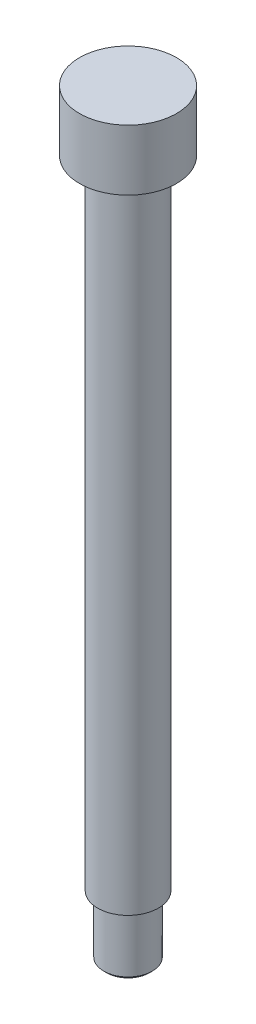
ISO-10303-21;
HEADER;
FILE_DESCRIPTION(('STEP AP214'),'2;1');
FILE_NAME('part.step','',(''),(''),'','','');
FILE_SCHEMA(('AUTOMOTIVE_DESIGN { 1 0 10303 214 1 1 1 1 }'));
ENDSEC;
DATA;
#1=APPLICATION_CONTEXT('core data for automotive mechanical design processes');
#2=APPLICATION_PROTOCOL_DEFINITION('international standard','automotive_design',2000,#1);
#3=PRODUCT_CONTEXT('',#1,'mechanical');
#4=PRODUCT('Part','Part','',(#3));
#5=PRODUCT_RELATED_PRODUCT_CATEGORY('part','',(#4));
#6=PRODUCT_DEFINITION_FORMATION('','',#4);
#7=PRODUCT_DEFINITION_CONTEXT('part definition',#1,'design');
#8=PRODUCT_DEFINITION('design','',#6,#7);
#9=PRODUCT_DEFINITION_SHAPE('','',#8);
#10=(LENGTH_UNIT() NAMED_UNIT(*) SI_UNIT(.MILLI.,.METRE.));
#11=(NAMED_UNIT(*) PLANE_ANGLE_UNIT() SI_UNIT($,.RADIAN.));
#12=(NAMED_UNIT(*) SI_UNIT($,.STERADIAN.) SOLID_ANGLE_UNIT());
#13=UNCERTAINTY_MEASURE_WITH_UNIT(LENGTH_MEASURE(1.E-05),#10,'distance_accuracy_value','');
#14=(GEOMETRIC_REPRESENTATION_CONTEXT(3) GLOBAL_UNCERTAINTY_ASSIGNED_CONTEXT((#13)) GLOBAL_UNIT_ASSIGNED_CONTEXT((#10,
#11,#12)) REPRESENTATION_CONTEXT('',''));
#15=CARTESIAN_POINT('',(0.,0.,0.));
#16=DIRECTION('',(0.,0.,1.));
#17=DIRECTION('',(1.,0.,0.));
#18=AXIS2_PLACEMENT_3D('',#15,#16,#17);
#19=CARTESIAN_POINT('',(0.,0.,0.));
#20=DIRECTION('',(0.,1.,0.));
#21=DIRECTION('',(0.,0.,1.));
#22=AXIS2_PLACEMENT_3D('',#19,#20,#21);
#23=PLANE('',#22);
#24=CARTESIAN_POINT('',(0.,0.,0.));
#25=DIRECTION('',(0.,-1.,0.));
#26=DIRECTION('',(0.,0.,-1.));
#27=AXIS2_PLACEMENT_3D('',#24,#25,#26);
#28=CIRCLE('',#27,8.);
#29=CARTESIAN_POINT('',(0.,0.,-8.));
#30=VERTEX_POINT('',#29);
#31=EDGE_CURVE('E59',#30,#30,#28,.T.);
#32=ORIENTED_EDGE('',*,*,#31,.F.);
#33=EDGE_LOOP('',(#32));
#34=FACE_BOUND('',#33,.T.);
#35=ADVANCED_FACE('F47',(#34),#23,.T.);
#36=CARTESIAN_POINT('',(0.,-130.,0.));
#37=DIRECTION('',(0.,-1.,0.));
#38=DIRECTION('',(0.,0.,-1.));
#39=AXIS2_PLACEMENT_3D('',#36,#37,#38);
#40=CYLINDRICAL_SURFACE('',#39,8.);
#41=ORIENTED_EDGE('',*,*,#31,.T.);
#42=EDGE_LOOP('',(#41));
#43=FACE_BOUND('',#42,.T.);
#44=CARTESIAN_POINT('',(0.,-9.99999999999999,0.));
#45=DIRECTION('',(0.,-1.,0.));
#46=DIRECTION('',(0.,0.,-1.));
#47=AXIS2_PLACEMENT_3D('',#44,#45,#46);
#48=CIRCLE('',#47,8.);
#49=CARTESIAN_POINT('',(0.,-9.99999999999999,-8.));
#50=VERTEX_POINT('',#49);
#51=EDGE_CURVE('E63',#50,#50,#48,.T.);
#52=ORIENTED_EDGE('',*,*,#51,.F.);
#53=EDGE_LOOP('',(#52));
#54=FACE_BOUND('',#53,.T.);
#55=ADVANCED_FACE('F96',(#43,#54),#40,.T.);
#56=CARTESIAN_POINT('',(5.,-10.,0.));
#57=DIRECTION('',(0.,-1.,0.));
#58=DIRECTION('',(0.,0.,-1.));
#59=AXIS2_PLACEMENT_3D('',#56,#57,#58);
#60=PLANE('',#59);
#61=ORIENTED_EDGE('',*,*,#51,.T.);
#62=EDGE_LOOP('',(#61));
#63=FACE_BOUND('',#62,.T.);
#64=CARTESIAN_POINT('',(0.,-9.99999999999999,0.));
#65=DIRECTION('',(0.,-1.,0.));
#66=DIRECTION('',(0.,0.,-1.));
#67=AXIS2_PLACEMENT_3D('',#64,#65,#66);
#68=CIRCLE('',#67,5.);
#69=CARTESIAN_POINT('',(0.,-9.99999999999999,-5.));
#70=VERTEX_POINT('',#69);
#71=EDGE_CURVE('E68',#70,#70,#68,.T.);
#72=ORIENTED_EDGE('',*,*,#71,.F.);
#73=EDGE_LOOP('',(#72));
#74=FACE_BOUND('',#73,.T.);
#75=ADVANCED_FACE('F92',(#63,#74),#60,.T.);
#76=CARTESIAN_POINT('',(0.,-130.,0.));
#77=DIRECTION('',(0.,-1.,0.));
#78=DIRECTION('',(0.,0.,-1.));
#79=AXIS2_PLACEMENT_3D('',#76,#77,#78);
#80=CYLINDRICAL_SURFACE('',#79,5.00000000000001);
#81=ORIENTED_EDGE('',*,*,#71,.T.);
#82=EDGE_LOOP('',(#81));
#83=FACE_BOUND('',#82,.T.);
#84=CARTESIAN_POINT('',(0.,-115.,0.));
#85=DIRECTION('',(0.,-1.,0.));
#86=DIRECTION('',(0.,0.,-1.));
#87=AXIS2_PLACEMENT_3D('',#84,#85,#86);
#88=CIRCLE('',#87,5.00000000000001);
#89=CARTESIAN_POINT('',(0.,-115.,-5.00000000000001));
#90=VERTEX_POINT('',#89);
#91=EDGE_CURVE('E71',#90,#90,#88,.T.);
#92=ORIENTED_EDGE('',*,*,#91,.F.);
#93=EDGE_LOOP('',(#92));
#94=FACE_BOUND('',#93,.T.);
#95=ADVANCED_FACE('F82',(#83,#94),#80,.T.);
#96=CARTESIAN_POINT('',(5.00000000000001,-115.,0.));
#97=DIRECTION('',(0.,-1.,0.));
#98=DIRECTION('',(0.,0.,-1.));
#99=AXIS2_PLACEMENT_3D('',#96,#97,#98);
#100=PLANE('',#99);
#101=ORIENTED_EDGE('',*,*,#91,.T.);
#102=EDGE_LOOP('',(#101));
#103=FACE_BOUND('',#102,.T.);
#104=CARTESIAN_POINT('',(0.,-115.,0.));
#105=DIRECTION('',(0.,-1.,0.));
#106=DIRECTION('',(0.,0.,-1.));
#107=AXIS2_PLACEMENT_3D('',#104,#105,#106);
#108=CIRCLE('',#107,4.);
#109=CARTESIAN_POINT('',(0.,-115.,-4.));
#110=VERTEX_POINT('',#109);
#111=EDGE_CURVE('E74',#110,#110,#108,.T.);
#112=ORIENTED_EDGE('',*,*,#111,.F.);
#113=EDGE_LOOP('',(#112));
#114=FACE_BOUND('',#113,.T.);
#115=ADVANCED_FACE('F80',(#103,#114),#100,.T.);
#116=CARTESIAN_POINT('',(0.,-130.,0.));
#117=DIRECTION('',(0.,-1.,0.));
#118=DIRECTION('',(0.,0.,-1.));
#119=AXIS2_PLACEMENT_3D('',#116,#117,#118);
#120=CYLINDRICAL_SURFACE('',#119,4.);
#121=CARTESIAN_POINT('',(0.,-124.5,0.));
#122=DIRECTION('',(0.,-1.,0.));
#123=DIRECTION('',(0.,0.,-1.));
#124=AXIS2_PLACEMENT_3D('',#121,#122,#123);
#125=CIRCLE('',#124,4.);
#126=CARTESIAN_POINT('',(0.,-124.5,-4.));
#127=VERTEX_POINT('',#126);
#128=EDGE_CURVE('E10',#127,#127,#125,.F.);
#129=ORIENTED_EDGE('',*,*,#128,.T.);
#130=EDGE_LOOP('',(#129));
#131=FACE_BOUND('',#130,.T.);
#132=ORIENTED_EDGE('',*,*,#111,.T.);
#133=EDGE_LOOP('',(#132));
#134=FACE_BOUND('',#133,.T.);
#135=ADVANCED_FACE('F78',(#131,#134),#120,.T.);
#136=CARTESIAN_POINT('',(4.,-125.,0.));
#137=DIRECTION('',(0.,-1.,0.));
#138=DIRECTION('',(0.,0.,-1.));
#139=AXIS2_PLACEMENT_3D('',#136,#137,#138);
#140=PLANE('',#139);
#141=CARTESIAN_POINT('',(0.,-125.,0.));
#142=DIRECTION('',(0.,-1.,0.));
#143=DIRECTION('',(0.,0.,-1.));
#144=AXIS2_PLACEMENT_3D('',#141,#142,#143);
#145=CIRCLE('',#144,3.50000000000004);
#146=CARTESIAN_POINT('',(0.,-125.,-3.50000000000004));
#147=VERTEX_POINT('',#146);
#148=EDGE_CURVE('E55',#147,#147,#145,.T.);
#149=ORIENTED_EDGE('',*,*,#148,.T.);
#150=EDGE_LOOP('',(#149));
#151=FACE_BOUND('',#150,.T.);
#152=ADVANCED_FACE('F90',(#151),#140,.T.);
#153=CARTESIAN_POINT('',(0.,-125.,0.));
#154=DIRECTION('',(0.,1.,0.));
#155=DIRECTION('',(0.,0.,1.));
#156=AXIS2_PLACEMENT_3D('',#153,#154,#155);
#157=CONICAL_SURFACE('',#156,3.50000000000004,0.785398163397448);
#158=ORIENTED_EDGE('',*,*,#128,.F.);
#159=EDGE_LOOP('',(#158));
#160=FACE_BOUND('',#159,.T.);
#161=ORIENTED_EDGE('',*,*,#148,.F.);
#162=EDGE_LOOP('',(#161));
#163=FACE_BOUND('',#162,.T.);
#164=ADVANCED_FACE('F50',(#160,#163),#157,.T.);
#165=CLOSED_SHELL('',(#35,#55,#75,#95,#115,#135,#152,#164));
#166=MANIFOLD_SOLID_BREP('B2',#165);
#167=ADVANCED_BREP_SHAPE_REPRESENTATION('',(#18,#166),#14);
#168=SHAPE_DEFINITION_REPRESENTATION(#9,#167);
ENDSEC;
END-ISO-10303-21;
